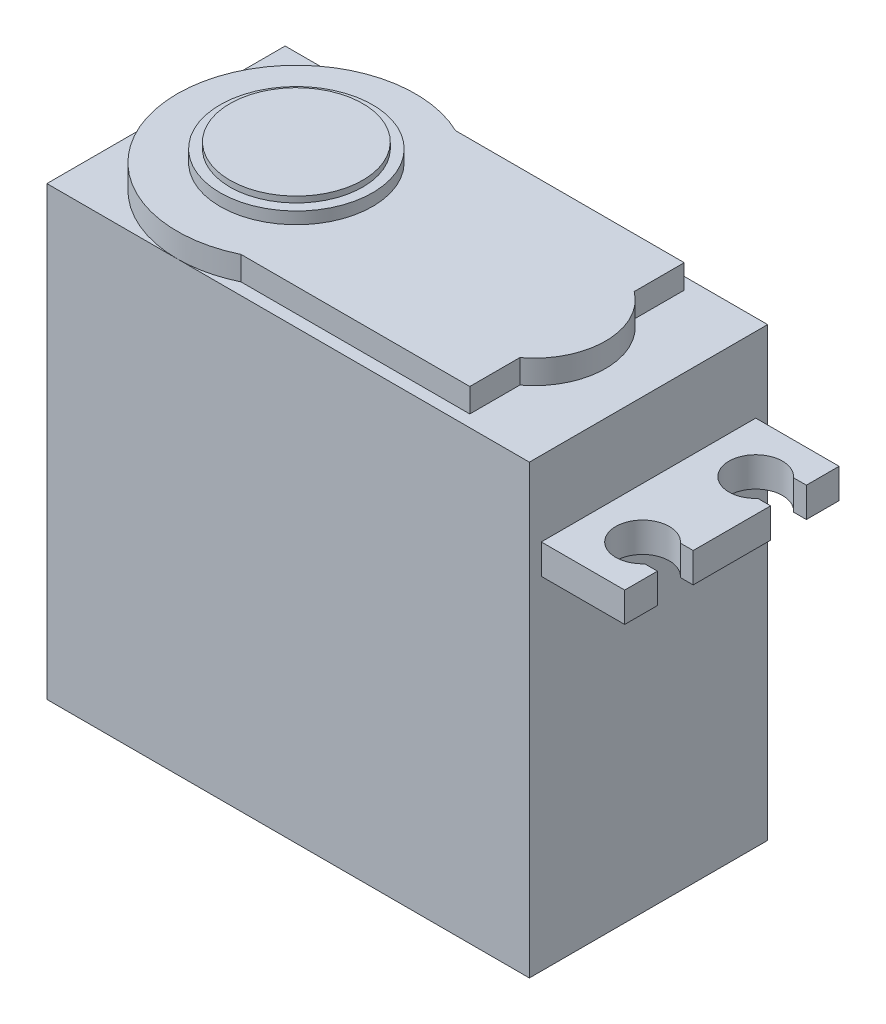
ISO-10303-21;
HEADER;
FILE_DESCRIPTION(('STEP AP214'),'2;1');
FILE_NAME('part.step','',(''),(''),'','','');
FILE_SCHEMA(('AUTOMOTIVE_DESIGN { 1 0 10303 214 1 1 1 1 }'));
ENDSEC;
DATA;
#1=APPLICATION_CONTEXT('core data for automotive mechanical design processes');
#2=APPLICATION_PROTOCOL_DEFINITION('international standard','automotive_design',2000,#1);
#3=PRODUCT_CONTEXT('',#1,'mechanical');
#4=PRODUCT('Part','Part','',(#3));
#5=PRODUCT_RELATED_PRODUCT_CATEGORY('part','',(#4));
#6=PRODUCT_DEFINITION_FORMATION('','',#4);
#7=PRODUCT_DEFINITION_CONTEXT('part definition',#1,'design');
#8=PRODUCT_DEFINITION('design','',#6,#7);
#9=PRODUCT_DEFINITION_SHAPE('','',#8);
#10=(LENGTH_UNIT() NAMED_UNIT(*) SI_UNIT(.MILLI.,.METRE.));
#11=(NAMED_UNIT(*) PLANE_ANGLE_UNIT() SI_UNIT($,.RADIAN.));
#12=(NAMED_UNIT(*) SI_UNIT($,.STERADIAN.) SOLID_ANGLE_UNIT());
#13=UNCERTAINTY_MEASURE_WITH_UNIT(LENGTH_MEASURE(1.E-05),#10,'distance_accuracy_value','');
#14=(GEOMETRIC_REPRESENTATION_CONTEXT(3) GLOBAL_UNCERTAINTY_ASSIGNED_CONTEXT((#13)) GLOBAL_UNIT_ASSIGNED_CONTEXT((#10,
#11,#12)) REPRESENTATION_CONTEXT('',''));
#15=CARTESIAN_POINT('',(0.,0.,0.));
#16=DIRECTION('',(0.,0.,1.));
#17=DIRECTION('',(1.,0.,0.));
#18=AXIS2_PLACEMENT_3D('',#15,#16,#17);
#19=CARTESIAN_POINT('',(-20.25,37.5,10.));
#20=DIRECTION('',(1.,0.,0.));
#21=DIRECTION('',(0.,0.,-1.));
#22=AXIS2_PLACEMENT_3D('',#19,#20,#21);
#23=PLANE('',#22);
#24=DIRECTION('',(0.,-1.,0.));
#25=VECTOR('',#24,1.);
#26=CARTESIAN_POINT('',(-20.25,37.5,-10.));
#27=LINE('',#26,#25);
#28=CARTESIAN_POINT('',(-20.25,37.5,-10.));
#29=VERTEX_POINT('',#28);
#30=CARTESIAN_POINT('',(-20.25,0.,-10.));
#31=VERTEX_POINT('',#30);
#32=EDGE_CURVE('E343',#29,#31,#27,.T.);
#33=ORIENTED_EDGE('',*,*,#32,.T.);
#34=DIRECTION('',(0.,0.,1.));
#35=VECTOR('',#34,1.);
#36=CARTESIAN_POINT('',(-20.25,0.,10.));
#37=LINE('',#36,#35);
#38=CARTESIAN_POINT('',(-20.25,0.,10.));
#39=VERTEX_POINT('',#38);
#40=EDGE_CURVE('E329',#31,#39,#37,.T.);
#41=ORIENTED_EDGE('',*,*,#40,.T.);
#42=DIRECTION('',(0.,-1.,0.));
#43=VECTOR('',#42,1.);
#44=CARTESIAN_POINT('',(-20.25,37.5,10.));
#45=LINE('',#44,#43);
#46=CARTESIAN_POINT('',(-20.25,37.5,10.));
#47=VERTEX_POINT('',#46);
#48=EDGE_CURVE('E37',#47,#39,#45,.T.);
#49=ORIENTED_EDGE('',*,*,#48,.F.);
#50=DIRECTION('',(0.,0.,1.));
#51=VECTOR('',#50,1.);
#52=CARTESIAN_POINT('',(-20.25,37.5,10.));
#53=LINE('',#52,#51);
#54=EDGE_CURVE('E330',#29,#47,#53,.T.);
#55=ORIENTED_EDGE('',*,*,#54,.F.);
#56=EDGE_LOOP('',(#33,#41,#49,#55));
#57=FACE_BOUND('',#56,.T.);
#58=ADVANCED_FACE('F34',(#57),#23,.F.);
#59=CARTESIAN_POINT('',(20.25,37.5,10.));
#60=DIRECTION('',(-1.,0.,0.));
#61=DIRECTION('',(0.,0.,1.));
#62=AXIS2_PLACEMENT_3D('',#59,#60,#61);
#63=PLANE('',#62);
#64=DIRECTION('',(0.,0.,-1.));
#65=VECTOR('',#64,1.);
#66=CARTESIAN_POINT('',(20.25,0.,10.));
#67=LINE('',#66,#65);
#68=CARTESIAN_POINT('',(20.25,0.,10.));
#69=VERTEX_POINT('',#68);
#70=CARTESIAN_POINT('',(20.25,0.,-10.));
#71=VERTEX_POINT('',#70);
#72=EDGE_CURVE('E348',#69,#71,#67,.T.);
#73=ORIENTED_EDGE('',*,*,#72,.T.);
#74=DIRECTION('',(0.,-1.,0.));
#75=VECTOR('',#74,1.);
#76=CARTESIAN_POINT('',(20.25,37.5,-10.));
#77=LINE('',#76,#75);
#78=CARTESIAN_POINT('',(20.25,37.5,-10.));
#79=VERTEX_POINT('',#78);
#80=EDGE_CURVE('E353',#79,#71,#77,.T.);
#81=ORIENTED_EDGE('',*,*,#80,.F.);
#82=DIRECTION('',(0.,0.,-1.));
#83=VECTOR('',#82,1.);
#84=CARTESIAN_POINT('',(20.25,37.5,10.));
#85=LINE('',#84,#83);
#86=CARTESIAN_POINT('',(20.25,37.5,10.));
#87=VERTEX_POINT('',#86);
#88=EDGE_CURVE('E338',#87,#79,#85,.T.);
#89=ORIENTED_EDGE('',*,*,#88,.F.);
#90=DIRECTION('',(0.,-1.,0.));
#91=VECTOR('',#90,1.);
#92=CARTESIAN_POINT('',(20.25,37.5,10.));
#93=LINE('',#92,#91);
#94=EDGE_CURVE('E355',#87,#69,#93,.T.);
#95=ORIENTED_EDGE('',*,*,#94,.T.);
#96=EDGE_LOOP('',(#73,#81,#89,#95));
#97=FACE_BOUND('',#96,.T.);
#98=DIRECTION('',(0.,0.,1.));
#99=VECTOR('',#98,1.);
#100=CARTESIAN_POINT('',(20.25,28.7,0.));
#101=LINE('',#100,#99);
#102=CARTESIAN_POINT('',(20.25,28.7,-9.));
#103=VERTEX_POINT('',#102);
#104=CARTESIAN_POINT('',(20.25,28.7,9.));
#105=VERTEX_POINT('',#104);
#106=EDGE_CURVE('E192',#103,#105,#101,.T.);
#107=ORIENTED_EDGE('',*,*,#106,.T.);
#108=DIRECTION('',(0.,1.,0.));
#109=VECTOR('',#108,1.);
#110=CARTESIAN_POINT('',(20.25,28.7,9.));
#111=LINE('',#110,#109);
#112=CARTESIAN_POINT('',(20.25,31.2,9.));
#113=VERTEX_POINT('',#112);
#114=EDGE_CURVE('E197',#105,#113,#111,.T.);
#115=ORIENTED_EDGE('',*,*,#114,.T.);
#116=DIRECTION('',(0.,0.,1.));
#117=VECTOR('',#116,1.);
#118=CARTESIAN_POINT('',(20.25,31.2,0.));
#119=LINE('',#118,#117);
#120=CARTESIAN_POINT('',(20.25,31.2,-9.));
#121=VERTEX_POINT('',#120);
#122=EDGE_CURVE('E244',#121,#113,#119,.T.);
#123=ORIENTED_EDGE('',*,*,#122,.F.);
#124=DIRECTION('',(0.,1.,0.));
#125=VECTOR('',#124,1.);
#126=CARTESIAN_POINT('',(20.25,28.7,-9.));
#127=LINE('',#126,#125);
#128=EDGE_CURVE('E198',#103,#121,#127,.T.);
#129=ORIENTED_EDGE('',*,*,#128,.F.);
#130=EDGE_LOOP('',(#107,#115,#123,#129));
#131=FACE_BOUND('',#130,.T.);
#132=ADVANCED_FACE('F194',(#97,#131),#63,.F.);
#133=CARTESIAN_POINT('',(-9.30889894354066,40.5,0.));
#134=DIRECTION('',(0.,1.,0.));
#135=DIRECTION('',(0.,0.,1.));
#136=AXIS2_PLACEMENT_3D('',#133,#134,#135);
#137=PLANE('',#136);
#138=CARTESIAN_POINT('',(-9.30889894354066,40.5,0.));
#139=DIRECTION('',(0.,1.,0.));
#140=DIRECTION('',(0.,0.,1.));
#141=AXIS2_PLACEMENT_3D('',#138,#139,#140);
#142=CIRCLE('',#141,6.4);
#143=CARTESIAN_POINT('',(-9.30889894354066,40.5,6.4));
#144=VERTEX_POINT('',#143);
#145=EDGE_CURVE('E279',#144,#144,#142,.T.);
#146=ORIENTED_EDGE('',*,*,#145,.T.);
#147=EDGE_LOOP('',(#146));
#148=FACE_BOUND('',#147,.T.);
#149=CARTESIAN_POINT('',(-9.30889894354066,40.5,0.));
#150=DIRECTION('',(0.,1.,0.));
#151=DIRECTION('',(0.,0.,1.));
#152=AXIS2_PLACEMENT_3D('',#149,#150,#151);
#153=CIRCLE('',#152,5.575);
#154=CARTESIAN_POINT('',(-9.30889894354066,40.5,5.575));
#155=VERTEX_POINT('',#154);
#156=EDGE_CURVE('E263',#155,#155,#153,.T.);
#157=ORIENTED_EDGE('',*,*,#156,.F.);
#158=EDGE_LOOP('',(#157));
#159=FACE_BOUND('',#158,.T.);
#160=ADVANCED_FACE('F406',(#148,#159),#137,.T.);
#161=CARTESIAN_POINT('',(-9.30889894354066,39.5,0.));
#162=DIRECTION('',(0.,1.,0.));
#163=DIRECTION('',(0.,0.,1.));
#164=AXIS2_PLACEMENT_3D('',#161,#162,#163);
#165=PLANE('',#164);
#166=CARTESIAN_POINT('',(-9.30889894354066,39.5,0.));
#167=DIRECTION('',(0.,1.,0.));
#168=DIRECTION('',(0.,0.,1.));
#169=AXIS2_PLACEMENT_3D('',#166,#167,#168);
#170=CIRCLE('',#169,10.);
#171=CARTESIAN_POINT('',(-4.94999999999999,39.5,-9.));
#172=VERTEX_POINT('',#171);
#173=CARTESIAN_POINT('',(-4.94999999999999,39.5,9.00000000000001));
#174=VERTEX_POINT('',#173);
#175=EDGE_CURVE('E284',#172,#174,#170,.T.);
#176=ORIENTED_EDGE('',*,*,#175,.T.);
#177=DIRECTION('',(1.,0.,0.));
#178=VECTOR('',#177,1.);
#179=CARTESIAN_POINT('',(-4.94999999999999,39.5,9.00000000000001));
#180=LINE('',#179,#178);
#181=CARTESIAN_POINT('',(14.25,39.5,9.00000000000001));
#182=VERTEX_POINT('',#181);
#183=EDGE_CURVE('E287',#174,#182,#180,.T.);
#184=ORIENTED_EDGE('',*,*,#183,.T.);
#185=DIRECTION('',(0.,0.,-1.));
#186=VECTOR('',#185,1.);
#187=CARTESIAN_POINT('',(14.25,39.5,9.00000000000001));
#188=LINE('',#187,#186);
#189=CARTESIAN_POINT('',(14.25,39.5,4.8));
#190=VERTEX_POINT('',#189);
#191=EDGE_CURVE('E290',#182,#190,#188,.T.);
#192=ORIENTED_EDGE('',*,*,#191,.T.);
#193=CARTESIAN_POINT('',(10.65,39.5,0.));
#194=DIRECTION('',(0.,1.,0.));
#195=DIRECTION('',(0.,0.,-1.));
#196=AXIS2_PLACEMENT_3D('',#193,#194,#195);
#197=CIRCLE('',#196,6.00000000000001);
#198=CARTESIAN_POINT('',(14.25,39.5,-4.8));
#199=VERTEX_POINT('',#198);
#200=EDGE_CURVE('E292',#190,#199,#197,.T.);
#201=ORIENTED_EDGE('',*,*,#200,.T.);
#202=DIRECTION('',(0.,0.,-1.));
#203=VECTOR('',#202,1.);
#204=CARTESIAN_POINT('',(14.25,39.5,-9.));
#205=LINE('',#204,#203);
#206=CARTESIAN_POINT('',(14.25,39.5,-9.));
#207=VERTEX_POINT('',#206);
#208=EDGE_CURVE('E294',#199,#207,#205,.T.);
#209=ORIENTED_EDGE('',*,*,#208,.T.);
#210=DIRECTION('',(-1.,0.,0.));
#211=VECTOR('',#210,1.);
#212=CARTESIAN_POINT('',(-4.94999999999999,39.5,-9.));
#213=LINE('',#212,#211);
#214=EDGE_CURVE('E296',#207,#172,#213,.T.);
#215=ORIENTED_EDGE('',*,*,#214,.T.);
#216=EDGE_LOOP('',(#176,#184,#192,#201,#209,#215));
#217=FACE_BOUND('',#216,.T.);
#218=CARTESIAN_POINT('',(-9.30889894354066,39.5,0.));
#219=DIRECTION('',(0.,1.,0.));
#220=DIRECTION('',(0.,0.,1.));
#221=AXIS2_PLACEMENT_3D('',#218,#219,#220);
#222=CIRCLE('',#221,6.4);
#223=CARTESIAN_POINT('',(-9.30889894354066,39.5,6.4));
#224=VERTEX_POINT('',#223);
#225=EDGE_CURVE('E276',#224,#224,#222,.T.);
#226=ORIENTED_EDGE('',*,*,#225,.F.);
#227=EDGE_LOOP('',(#226));
#228=FACE_BOUND('',#227,.T.);
#229=ADVANCED_FACE('F375',(#217,#228),#165,.T.);
#230=CARTESIAN_POINT('',(0.,37.5,0.));
#231=DIRECTION('',(0.,-1.,0.));
#232=DIRECTION('',(0.,0.,-1.));
#233=AXIS2_PLACEMENT_3D('',#230,#231,#232);
#234=PLANE('',#233);
#235=CARTESIAN_POINT('',(-9.30889894354066,37.5,0.));
#236=DIRECTION('',(0.,1.,0.));
#237=DIRECTION('',(0.,0.,1.));
#238=AXIS2_PLACEMENT_3D('',#235,#236,#237);
#239=CIRCLE('',#238,10.);
#240=CARTESIAN_POINT('',(-4.94999999999999,37.5,-9.));
#241=VERTEX_POINT('',#240);
#242=CARTESIAN_POINT('',(-9.30889894354066,37.5,-10.));
#243=VERTEX_POINT('',#242);
#244=EDGE_CURVE('E44',#241,#243,#239,.T.);
#245=ORIENTED_EDGE('',*,*,#244,.F.);
#246=DIRECTION('',(-1.,0.,0.));
#247=VECTOR('',#246,1.);
#248=CARTESIAN_POINT('',(-4.94999999999999,37.5,-9.));
#249=LINE('',#248,#247);
#250=CARTESIAN_POINT('',(14.25,37.5,-9.));
#251=VERTEX_POINT('',#250);
#252=EDGE_CURVE('E288',#251,#241,#249,.T.);
#253=ORIENTED_EDGE('',*,*,#252,.F.);
#254=DIRECTION('',(0.,0.,-1.));
#255=VECTOR('',#254,1.);
#256=CARTESIAN_POINT('',(14.25,37.5,-9.));
#257=LINE('',#256,#255);
#258=CARTESIAN_POINT('',(14.25,37.5,-4.8));
#259=VERTEX_POINT('',#258);
#260=EDGE_CURVE('E308',#259,#251,#257,.T.);
#261=ORIENTED_EDGE('',*,*,#260,.F.);
#262=CARTESIAN_POINT('',(10.65,37.5,0.));
#263=DIRECTION('',(0.,1.,0.));
#264=DIRECTION('',(0.,0.,-1.));
#265=AXIS2_PLACEMENT_3D('',#262,#263,#264);
#266=CIRCLE('',#265,6.00000000000001);
#267=CARTESIAN_POINT('',(14.25,37.5,4.8));
#268=VERTEX_POINT('',#267);
#269=EDGE_CURVE('E305',#268,#259,#266,.T.);
#270=ORIENTED_EDGE('',*,*,#269,.F.);
#271=DIRECTION('',(0.,0.,-1.));
#272=VECTOR('',#271,1.);
#273=CARTESIAN_POINT('',(14.25,37.5,9.00000000000001));
#274=LINE('',#273,#272);
#275=CARTESIAN_POINT('',(14.25,37.5,9.00000000000001));
#276=VERTEX_POINT('',#275);
#277=EDGE_CURVE('E302',#276,#268,#274,.T.);
#278=ORIENTED_EDGE('',*,*,#277,.F.);
#279=DIRECTION('',(1.,0.,0.));
#280=VECTOR('',#279,1.);
#281=CARTESIAN_POINT('',(-4.94999999999999,37.5,9.00000000000001));
#282=LINE('',#281,#280);
#283=CARTESIAN_POINT('',(-4.94999999999999,37.5,9.00000000000001));
#284=VERTEX_POINT('',#283);
#285=EDGE_CURVE('E299',#284,#276,#282,.T.);
#286=ORIENTED_EDGE('',*,*,#285,.F.);
#287=CARTESIAN_POINT('',(-9.30889894354066,37.5,10.));
#288=VERTEX_POINT('',#287);
#289=EDGE_CURVE('E42',#288,#284,#239,.T.);
#290=ORIENTED_EDGE('',*,*,#289,.F.);
#291=DIRECTION('',(1.,0.,0.));
#292=VECTOR('',#291,1.);
#293=CARTESIAN_POINT('',(-20.25,37.5,10.));
#294=LINE('',#293,#292);
#295=EDGE_CURVE('E333',#288,#87,#294,.T.);
#296=ORIENTED_EDGE('',*,*,#295,.T.);
#297=ORIENTED_EDGE('',*,*,#88,.T.);
#298=DIRECTION('',(-1.,0.,0.));
#299=VECTOR('',#298,1.);
#300=CARTESIAN_POINT('',(-20.25,37.5,-10.));
#301=LINE('',#300,#299);
#302=EDGE_CURVE('E341',#79,#243,#301,.T.);
#303=ORIENTED_EDGE('',*,*,#302,.T.);
#304=EDGE_LOOP('',(#245,#253,#261,#270,#278,#286,#290,#296,#297,#303));
#305=FACE_BOUND('',#304,.T.);
#306=ADVANCED_FACE('F382',(#305),#234,.F.);
#307=EDGE_CURVE('E11',#243,#288,#239,.T.);
#308=ORIENTED_EDGE('',*,*,#307,.F.);
#309=EDGE_CURVE('E340',#243,#29,#301,.T.);
#310=ORIENTED_EDGE('',*,*,#309,.T.);
#311=ORIENTED_EDGE('',*,*,#54,.T.);
#312=EDGE_CURVE('E335',#47,#288,#294,.T.);
#313=ORIENTED_EDGE('',*,*,#312,.T.);
#314=EDGE_LOOP('',(#308,#310,#311,#313));
#315=FACE_BOUND('',#314,.T.);
#316=ADVANCED_FACE('F421',(#315),#234,.F.);
#317=CARTESIAN_POINT('',(-20.25,37.5,10.));
#318=DIRECTION('',(0.,0.,-1.));
#319=DIRECTION('',(-1.,0.,0.));
#320=AXIS2_PLACEMENT_3D('',#317,#318,#319);
#321=PLANE('',#320);
#322=DIRECTION('',(1.,0.,0.));
#323=VECTOR('',#322,1.);
#324=CARTESIAN_POINT('',(-20.25,0.,10.));
#325=LINE('',#324,#323);
#326=EDGE_CURVE('E346',#39,#69,#325,.T.);
#327=ORIENTED_EDGE('',*,*,#326,.T.);
#328=ORIENTED_EDGE('',*,*,#94,.F.);
#329=ORIENTED_EDGE('',*,*,#295,.F.);
#330=ORIENTED_EDGE('',*,*,#312,.F.);
#331=ORIENTED_EDGE('',*,*,#48,.T.);
#332=EDGE_LOOP('',(#327,#328,#329,#330,#331));
#333=FACE_BOUND('',#332,.T.);
#334=ADVANCED_FACE('F419',(#333),#321,.F.);
#335=CARTESIAN_POINT('',(-20.25,37.5,-10.));
#336=DIRECTION('',(0.,0.,1.));
#337=DIRECTION('',(1.,0.,0.));
#338=AXIS2_PLACEMENT_3D('',#335,#336,#337);
#339=PLANE('',#338);
#340=DIRECTION('',(-1.,0.,0.));
#341=VECTOR('',#340,1.);
#342=CARTESIAN_POINT('',(-20.25,0.,-10.));
#343=LINE('',#342,#341);
#344=EDGE_CURVE('E334',#71,#31,#343,.T.);
#345=ORIENTED_EDGE('',*,*,#344,.T.);
#346=ORIENTED_EDGE('',*,*,#32,.F.);
#347=ORIENTED_EDGE('',*,*,#309,.F.);
#348=ORIENTED_EDGE('',*,*,#302,.F.);
#349=ORIENTED_EDGE('',*,*,#80,.T.);
#350=EDGE_LOOP('',(#345,#346,#347,#348,#349));
#351=FACE_BOUND('',#350,.T.);
#352=ADVANCED_FACE('F414',(#351),#339,.F.);
#353=CARTESIAN_POINT('',(0.,0.,0.));
#354=DIRECTION('',(0.,-1.,0.));
#355=DIRECTION('',(0.,0.,-1.));
#356=AXIS2_PLACEMENT_3D('',#353,#354,#355);
#357=PLANE('',#356);
#358=ORIENTED_EDGE('',*,*,#40,.F.);
#359=ORIENTED_EDGE('',*,*,#344,.F.);
#360=ORIENTED_EDGE('',*,*,#72,.F.);
#361=ORIENTED_EDGE('',*,*,#326,.F.);
#362=EDGE_LOOP('',(#358,#359,#360,#361));
#363=FACE_BOUND('',#362,.T.);
#364=ADVANCED_FACE('F418',(#363),#357,.T.);
#365=CARTESIAN_POINT('',(-9.30889894354066,39.5,0.));
#366=DIRECTION('',(0.,-1.,0.));
#367=DIRECTION('',(0.,0.,-1.));
#368=AXIS2_PLACEMENT_3D('',#365,#366,#367);
#369=CYLINDRICAL_SURFACE('',#368,10.);
#370=ORIENTED_EDGE('',*,*,#244,.T.);
#371=ORIENTED_EDGE('',*,*,#307,.T.);
#372=ORIENTED_EDGE('',*,*,#289,.T.);
#373=DIRECTION('',(0.,-1.,0.));
#374=VECTOR('',#373,1.);
#375=CARTESIAN_POINT('',(-4.94999999999999,39.5,9.00000000000001));
#376=LINE('',#375,#374);
#377=EDGE_CURVE('E326',#174,#284,#376,.T.);
#378=ORIENTED_EDGE('',*,*,#377,.F.);
#379=ORIENTED_EDGE('',*,*,#175,.F.);
#380=DIRECTION('',(0.,-1.,0.));
#381=VECTOR('',#380,1.);
#382=CARTESIAN_POINT('',(-4.94999999999999,39.5,-9.));
#383=LINE('',#382,#381);
#384=EDGE_CURVE('E297',#172,#241,#383,.T.);
#385=ORIENTED_EDGE('',*,*,#384,.T.);
#386=EDGE_LOOP('',(#370,#371,#372,#378,#379,#385));
#387=FACE_BOUND('',#386,.T.);
#388=ADVANCED_FACE('F367',(#387),#369,.T.);
#389=CARTESIAN_POINT('',(-4.94999999999999,39.5,9.00000000000001));
#390=DIRECTION('',(0.,0.,-1.));
#391=DIRECTION('',(-1.,0.,0.));
#392=AXIS2_PLACEMENT_3D('',#389,#390,#391);
#393=PLANE('',#392);
#394=ORIENTED_EDGE('',*,*,#285,.T.);
#395=DIRECTION('',(0.,-1.,0.));
#396=VECTOR('',#395,1.);
#397=CARTESIAN_POINT('',(14.25,39.5,9.00000000000001));
#398=LINE('',#397,#396);
#399=EDGE_CURVE('E323',#182,#276,#398,.T.);
#400=ORIENTED_EDGE('',*,*,#399,.F.);
#401=ORIENTED_EDGE('',*,*,#183,.F.);
#402=ORIENTED_EDGE('',*,*,#377,.T.);
#403=EDGE_LOOP('',(#394,#400,#401,#402));
#404=FACE_BOUND('',#403,.T.);
#405=ADVANCED_FACE('F371',(#404),#393,.F.);
#406=CARTESIAN_POINT('',(14.25,39.5,9.00000000000001));
#407=DIRECTION('',(-1.,0.,0.));
#408=DIRECTION('',(0.,0.,1.));
#409=AXIS2_PLACEMENT_3D('',#406,#407,#408);
#410=PLANE('',#409);
#411=ORIENTED_EDGE('',*,*,#277,.T.);
#412=DIRECTION('',(0.,-1.,0.));
#413=VECTOR('',#412,1.);
#414=CARTESIAN_POINT('',(14.25,39.5,4.8));
#415=LINE('',#414,#413);
#416=EDGE_CURVE('E320',#190,#268,#415,.T.);
#417=ORIENTED_EDGE('',*,*,#416,.F.);
#418=ORIENTED_EDGE('',*,*,#191,.F.);
#419=ORIENTED_EDGE('',*,*,#399,.T.);
#420=EDGE_LOOP('',(#411,#417,#418,#419));
#421=FACE_BOUND('',#420,.T.);
#422=ADVANCED_FACE('F392',(#421),#410,.F.);
#423=CARTESIAN_POINT('',(10.65,39.5,0.));
#424=DIRECTION('',(0.,-1.,0.));
#425=DIRECTION('',(0.,0.,-1.));
#426=AXIS2_PLACEMENT_3D('',#423,#424,#425);
#427=CYLINDRICAL_SURFACE('',#426,6.00000000000001);
#428=ORIENTED_EDGE('',*,*,#269,.T.);
#429=DIRECTION('',(0.,-1.,0.));
#430=VECTOR('',#429,1.);
#431=CARTESIAN_POINT('',(14.25,39.5,-4.8));
#432=LINE('',#431,#430);
#433=EDGE_CURVE('E317',#199,#259,#432,.T.);
#434=ORIENTED_EDGE('',*,*,#433,.F.);
#435=ORIENTED_EDGE('',*,*,#200,.F.);
#436=ORIENTED_EDGE('',*,*,#416,.T.);
#437=EDGE_LOOP('',(#428,#434,#435,#436));
#438=FACE_BOUND('',#437,.T.);
#439=ADVANCED_FACE('F389',(#438),#427,.T.);
#440=CARTESIAN_POINT('',(14.25,39.5,-9.));
#441=DIRECTION('',(-1.,0.,0.));
#442=DIRECTION('',(0.,0.,1.));
#443=AXIS2_PLACEMENT_3D('',#440,#441,#442);
#444=PLANE('',#443);
#445=ORIENTED_EDGE('',*,*,#260,.T.);
#446=DIRECTION('',(0.,-1.,0.));
#447=VECTOR('',#446,1.);
#448=CARTESIAN_POINT('',(14.25,39.5,-9.));
#449=LINE('',#448,#447);
#450=EDGE_CURVE('E314',#207,#251,#449,.T.);
#451=ORIENTED_EDGE('',*,*,#450,.F.);
#452=ORIENTED_EDGE('',*,*,#208,.F.);
#453=ORIENTED_EDGE('',*,*,#433,.T.);
#454=EDGE_LOOP('',(#445,#451,#452,#453));
#455=FACE_BOUND('',#454,.T.);
#456=ADVANCED_FACE('F384',(#455),#444,.F.);
#457=CARTESIAN_POINT('',(-4.94999999999999,39.5,-9.));
#458=DIRECTION('',(0.,0.,1.));
#459=DIRECTION('',(1.,0.,0.));
#460=AXIS2_PLACEMENT_3D('',#457,#458,#459);
#461=PLANE('',#460);
#462=ORIENTED_EDGE('',*,*,#252,.T.);
#463=ORIENTED_EDGE('',*,*,#384,.F.);
#464=ORIENTED_EDGE('',*,*,#214,.F.);
#465=ORIENTED_EDGE('',*,*,#450,.T.);
#466=EDGE_LOOP('',(#462,#463,#464,#465));
#467=FACE_BOUND('',#466,.T.);
#468=ADVANCED_FACE('F380',(#467),#461,.F.);
#469=CARTESIAN_POINT('',(-9.30889894354066,40.5,0.));
#470=DIRECTION('',(0.,-1.,0.));
#471=DIRECTION('',(0.,0.,-1.));
#472=AXIS2_PLACEMENT_3D('',#469,#470,#471);
#473=CYLINDRICAL_SURFACE('',#472,6.4);
#474=ORIENTED_EDGE('',*,*,#145,.F.);
#475=EDGE_LOOP('',(#474));
#476=FACE_BOUND('',#475,.T.);
#477=ORIENTED_EDGE('',*,*,#225,.T.);
#478=EDGE_LOOP('',(#477));
#479=FACE_BOUND('',#478,.T.);
#480=ADVANCED_FACE('F478',(#476,#479),#473,.T.);
#481=CARTESIAN_POINT('',(-9.30889894354066,41.,0.));
#482=DIRECTION('',(0.,-1.,0.));
#483=DIRECTION('',(0.,0.,-1.));
#484=AXIS2_PLACEMENT_3D('',#481,#482,#483);
#485=CYLINDRICAL_SURFACE('',#484,5.575);
#486=CARTESIAN_POINT('',(-9.30889894354066,41.,0.));
#487=DIRECTION('',(0.,1.,0.));
#488=DIRECTION('',(0.,0.,1.));
#489=AXIS2_PLACEMENT_3D('',#486,#487,#488);
#490=CIRCLE('',#489,5.575);
#491=CARTESIAN_POINT('',(-9.30889894354066,41.,5.575));
#492=VERTEX_POINT('',#491);
#493=EDGE_CURVE('E273',#492,#492,#490,.T.);
#494=ORIENTED_EDGE('',*,*,#493,.F.);
#495=EDGE_LOOP('',(#494));
#496=FACE_BOUND('',#495,.T.);
#497=ORIENTED_EDGE('',*,*,#156,.T.);
#498=EDGE_LOOP('',(#497));
#499=FACE_BOUND('',#498,.T.);
#500=ADVANCED_FACE('F496',(#496,#499),#485,.T.);
#501=CARTESIAN_POINT('',(-9.30889894354066,41.,0.));
#502=DIRECTION('',(0.,1.,0.));
#503=DIRECTION('',(0.,0.,1.));
#504=AXIS2_PLACEMENT_3D('',#501,#502,#503);
#505=PLANE('',#504);
#506=ORIENTED_EDGE('',*,*,#493,.T.);
#507=EDGE_LOOP('',(#506));
#508=FACE_BOUND('',#507,.T.);
#509=ADVANCED_FACE('F515',(#508),#505,.T.);
#510=CARTESIAN_POINT('',(20.25,28.7,-9.));
#511=DIRECTION('',(0.,0.,-1.));
#512=DIRECTION('',(-1.,0.,0.));
#513=AXIS2_PLACEMENT_3D('',#510,#511,#512);
#514=PLANE('',#513);
#515=DIRECTION('',(-1.,0.,0.));
#516=VECTOR('',#515,1.);
#517=CARTESIAN_POINT('',(20.25,31.2,-9.));
#518=LINE('',#517,#516);
#519=CARTESIAN_POINT('',(27.25,31.2,-9.));
#520=VERTEX_POINT('',#519);
#521=EDGE_CURVE('E51',#520,#121,#518,.T.);
#522=ORIENTED_EDGE('',*,*,#521,.F.);
#523=DIRECTION('',(0.,1.,0.));
#524=VECTOR('',#523,1.);
#525=CARTESIAN_POINT('',(27.25,28.7,-9.));
#526=LINE('',#525,#524);
#527=CARTESIAN_POINT('',(27.25,28.7,-9.));
#528=VERTEX_POINT('',#527);
#529=EDGE_CURVE('E264',#528,#520,#526,.T.);
#530=ORIENTED_EDGE('',*,*,#529,.F.);
#531=DIRECTION('',(-1.,0.,0.));
#532=VECTOR('',#531,1.);
#533=CARTESIAN_POINT('',(20.25,28.7,-9.));
#534=LINE('',#533,#532);
#535=EDGE_CURVE('E241',#528,#103,#534,.T.);
#536=ORIENTED_EDGE('',*,*,#535,.T.);
#537=ORIENTED_EDGE('',*,*,#128,.T.);
#538=EDGE_LOOP('',(#522,#530,#536,#537));
#539=FACE_BOUND('',#538,.T.);
#540=ADVANCED_FACE('F525',(#539),#514,.T.);
#541=CARTESIAN_POINT('',(27.25,28.7,-6.25));
#542=DIRECTION('',(1.,0.,0.));
#543=DIRECTION('',(0.,0.,-1.));
#544=AXIS2_PLACEMENT_3D('',#541,#542,#543);
#545=PLANE('',#544);
#546=DIRECTION('',(0.,0.,-1.));
#547=VECTOR('',#546,1.);
#548=CARTESIAN_POINT('',(27.25,31.2,-6.25));
#549=LINE('',#548,#547);
#550=CARTESIAN_POINT('',(27.25,31.2,-6.25));
#551=VERTEX_POINT('',#550);
#552=EDGE_CURVE('E259',#551,#520,#549,.T.);
#553=ORIENTED_EDGE('',*,*,#552,.F.);
#554=DIRECTION('',(0.,1.,0.));
#555=VECTOR('',#554,1.);
#556=CARTESIAN_POINT('',(27.25,28.7,-6.25));
#557=LINE('',#556,#555);
#558=CARTESIAN_POINT('',(27.25,28.7,-6.25));
#559=VERTEX_POINT('',#558);
#560=EDGE_CURVE('E266',#559,#551,#557,.T.);
#561=ORIENTED_EDGE('',*,*,#560,.F.);
#562=DIRECTION('',(0.,0.,-1.));
#563=VECTOR('',#562,1.);
#564=CARTESIAN_POINT('',(27.25,28.7,-6.25));
#565=LINE('',#564,#563);
#566=EDGE_CURVE('E238',#559,#528,#565,.T.);
#567=ORIENTED_EDGE('',*,*,#566,.T.);
#568=ORIENTED_EDGE('',*,*,#529,.T.);
#569=EDGE_LOOP('',(#553,#561,#567,#568));
#570=FACE_BOUND('',#569,.T.);
#571=ADVANCED_FACE('F535',(#570),#545,.T.);
#572=CARTESIAN_POINT('',(26.1770509831249,28.7,-6.25));
#573=DIRECTION('',(0.,0.,1.));
#574=DIRECTION('',(1.,0.,0.));
#575=AXIS2_PLACEMENT_3D('',#572,#573,#574);
#576=PLANE('',#575);
#577=DIRECTION('',(1.,0.,0.));
#578=VECTOR('',#577,1.);
#579=CARTESIAN_POINT('',(26.1770509831249,31.2,-6.25));
#580=LINE('',#579,#578);
#581=CARTESIAN_POINT('',(26.1770509831249,31.2,-6.25));
#582=VERTEX_POINT('',#581);
#583=EDGE_CURVE('E256',#582,#551,#580,.T.);
#584=ORIENTED_EDGE('',*,*,#583,.F.);
#585=DIRECTION('',(0.,1.,0.));
#586=VECTOR('',#585,1.);
#587=CARTESIAN_POINT('',(26.1770509831249,28.7,-6.25));
#588=LINE('',#587,#586);
#589=CARTESIAN_POINT('',(26.1770509831249,28.7,-6.25));
#590=VERTEX_POINT('',#589);
#591=EDGE_CURVE('E268',#590,#582,#588,.T.);
#592=ORIENTED_EDGE('',*,*,#591,.F.);
#593=DIRECTION('',(1.,0.,0.));
#594=VECTOR('',#593,1.);
#595=CARTESIAN_POINT('',(26.1770509831249,28.7,-6.25));
#596=LINE('',#595,#594);
#597=EDGE_CURVE('E235',#590,#559,#596,.T.);
#598=ORIENTED_EDGE('',*,*,#597,.T.);
#599=ORIENTED_EDGE('',*,*,#560,.T.);
#600=EDGE_LOOP('',(#584,#592,#598,#599));
#601=FACE_BOUND('',#600,.T.);
#602=ADVANCED_FACE('F545',(#601),#576,.T.);
#603=CARTESIAN_POINT('',(24.5,28.7,-4.75));
#604=DIRECTION('',(0.,1.,0.));
#605=DIRECTION('',(0.,0.,1.));
#606=AXIS2_PLACEMENT_3D('',#603,#604,#605);
#607=CYLINDRICAL_SURFACE('',#606,2.25);
#608=CARTESIAN_POINT('',(24.5,31.2,-4.75));
#609=DIRECTION('',(0.,-1.,0.));
#610=DIRECTION('',(0.,0.,1.));
#611=AXIS2_PLACEMENT_3D('',#608,#609,#610);
#612=CIRCLE('',#611,2.25);
#613=CARTESIAN_POINT('',(26.1770509831249,31.2,-3.25));
#614=VERTEX_POINT('',#613);
#615=EDGE_CURVE('E253',#614,#582,#612,.T.);
#616=ORIENTED_EDGE('',*,*,#615,.F.);
#617=DIRECTION('',(0.,1.,0.));
#618=VECTOR('',#617,1.);
#619=CARTESIAN_POINT('',(26.1770509831249,28.7,-3.25));
#620=LINE('',#619,#618);
#621=CARTESIAN_POINT('',(26.1770509831249,28.7,-3.25));
#622=VERTEX_POINT('',#621);
#623=EDGE_CURVE('E270',#622,#614,#620,.T.);
#624=ORIENTED_EDGE('',*,*,#623,.F.);
#625=CARTESIAN_POINT('',(24.5,28.7,-4.75));
#626=DIRECTION('',(0.,-1.,0.));
#627=DIRECTION('',(0.,0.,1.));
#628=AXIS2_PLACEMENT_3D('',#625,#626,#627);
#629=CIRCLE('',#628,2.25);
#630=EDGE_CURVE('E232',#622,#590,#629,.T.);
#631=ORIENTED_EDGE('',*,*,#630,.T.);
#632=ORIENTED_EDGE('',*,*,#591,.T.);
#633=EDGE_LOOP('',(#616,#624,#631,#632));
#634=FACE_BOUND('',#633,.T.);
#635=ADVANCED_FACE('F555',(#634),#607,.F.);
#636=CARTESIAN_POINT('',(26.1770509831249,28.7,-3.25));
#637=DIRECTION('',(0.,0.,-1.));
#638=DIRECTION('',(-1.,0.,0.));
#639=AXIS2_PLACEMENT_3D('',#636,#637,#638);
#640=PLANE('',#639);
#641=DIRECTION('',(-1.,0.,0.));
#642=VECTOR('',#641,1.);
#643=CARTESIAN_POINT('',(26.1770509831249,31.2,-3.25));
#644=LINE('',#643,#642);
#645=CARTESIAN_POINT('',(27.25,31.2,-3.25));
#646=VERTEX_POINT('',#645);
#647=EDGE_CURVE('E250',#646,#614,#644,.T.);
#648=ORIENTED_EDGE('',*,*,#647,.F.);
#649=DIRECTION('',(0.,1.,0.));
#650=VECTOR('',#649,1.);
#651=CARTESIAN_POINT('',(27.25,28.7,-3.25));
#652=LINE('',#651,#650);
#653=CARTESIAN_POINT('',(27.25,28.7,-3.25));
#654=VERTEX_POINT('',#653);
#655=EDGE_CURVE('E243',#654,#646,#652,.T.);
#656=ORIENTED_EDGE('',*,*,#655,.F.);
#657=DIRECTION('',(-1.,0.,0.));
#658=VECTOR('',#657,1.);
#659=CARTESIAN_POINT('',(26.1770509831249,28.7,-3.25));
#660=LINE('',#659,#658);
#661=EDGE_CURVE('E229',#654,#622,#660,.T.);
#662=ORIENTED_EDGE('',*,*,#661,.T.);
#663=ORIENTED_EDGE('',*,*,#623,.T.);
#664=EDGE_LOOP('',(#648,#656,#662,#663));
#665=FACE_BOUND('',#664,.T.);
#666=ADVANCED_FACE('F565',(#665),#640,.T.);
#667=CARTESIAN_POINT('',(27.25,28.7,0.));
#668=DIRECTION('',(1.,0.,0.));
#669=DIRECTION('',(0.,0.,-1.));
#670=AXIS2_PLACEMENT_3D('',#667,#668,#669);
#671=PLANE('',#670);
#672=DIRECTION('',(0.,0.,-1.));
#673=VECTOR('',#672,1.);
#674=CARTESIAN_POINT('',(27.25,31.2,0.));
#675=LINE('',#674,#673);
#676=CARTESIAN_POINT('',(27.25,31.2,3.25));
#677=VERTEX_POINT('',#676);
#678=EDGE_CURVE('E246',#677,#646,#675,.T.);
#679=ORIENTED_EDGE('',*,*,#678,.F.);
#680=DIRECTION('',(0.,1.,0.));
#681=VECTOR('',#680,1.);
#682=CARTESIAN_POINT('',(27.25,28.7,3.25));
#683=LINE('',#682,#681);
#684=CARTESIAN_POINT('',(27.25,28.7,3.25));
#685=VERTEX_POINT('',#684);
#686=EDGE_CURVE('E247',#685,#677,#683,.T.);
#687=ORIENTED_EDGE('',*,*,#686,.F.);
#688=DIRECTION('',(0.,0.,-1.));
#689=VECTOR('',#688,1.);
#690=CARTESIAN_POINT('',(27.25,28.7,0.));
#691=LINE('',#690,#689);
#692=EDGE_CURVE('E202',#685,#654,#691,.T.);
#693=ORIENTED_EDGE('',*,*,#692,.T.);
#694=ORIENTED_EDGE('',*,*,#655,.T.);
#695=EDGE_LOOP('',(#679,#687,#693,#694));
#696=FACE_BOUND('',#695,.T.);
#697=ADVANCED_FACE('F575',(#696),#671,.T.);
#698=CARTESIAN_POINT('',(24.5,28.7,-4.75));
#699=DIRECTION('',(0.,1.,0.));
#700=DIRECTION('',(0.,0.,1.));
#701=AXIS2_PLACEMENT_3D('',#698,#699,#700);
#702=PLANE('',#701);
#703=ORIENTED_EDGE('',*,*,#106,.F.);
#704=ORIENTED_EDGE('',*,*,#535,.F.);
#705=ORIENTED_EDGE('',*,*,#566,.F.);
#706=ORIENTED_EDGE('',*,*,#597,.F.);
#707=ORIENTED_EDGE('',*,*,#630,.F.);
#708=ORIENTED_EDGE('',*,*,#661,.F.);
#709=ORIENTED_EDGE('',*,*,#692,.F.);
#710=DIRECTION('',(-1.,0.,0.));
#711=VECTOR('',#710,1.);
#712=CARTESIAN_POINT('',(26.1770509831249,28.7,3.25));
#713=LINE('',#712,#711);
#714=CARTESIAN_POINT('',(26.1770509831249,28.7,3.25));
#715=VERTEX_POINT('',#714);
#716=EDGE_CURVE('E219',#685,#715,#713,.T.);
#717=ORIENTED_EDGE('',*,*,#716,.T.);
#718=CARTESIAN_POINT('',(24.5,28.7,4.75));
#719=DIRECTION('',(0.,1.,0.));
#720=DIRECTION('',(0.,0.,-1.));
#721=AXIS2_PLACEMENT_3D('',#718,#719,#720);
#722=CIRCLE('',#721,2.25);
#723=CARTESIAN_POINT('',(26.1770509831249,28.7,6.25));
#724=VERTEX_POINT('',#723);
#725=EDGE_CURVE('E223',#715,#724,#722,.T.);
#726=ORIENTED_EDGE('',*,*,#725,.T.);
#727=DIRECTION('',(1.,0.,0.));
#728=VECTOR('',#727,1.);
#729=CARTESIAN_POINT('',(26.1770509831249,28.7,6.25));
#730=LINE('',#729,#728);
#731=CARTESIAN_POINT('',(27.25,28.7,6.25));
#732=VERTEX_POINT('',#731);
#733=EDGE_CURVE('E693',#724,#732,#730,.T.);
#734=ORIENTED_EDGE('',*,*,#733,.T.);
#735=DIRECTION('',(0.,0.,1.));
#736=VECTOR('',#735,1.);
#737=CARTESIAN_POINT('',(27.25,28.7,6.25));
#738=LINE('',#737,#736);
#739=CARTESIAN_POINT('',(27.25,28.7,9.));
#740=VERTEX_POINT('',#739);
#741=EDGE_CURVE('E208',#732,#740,#738,.T.);
#742=ORIENTED_EDGE('',*,*,#741,.T.);
#743=DIRECTION('',(-1.,0.,0.));
#744=VECTOR('',#743,1.);
#745=CARTESIAN_POINT('',(20.25,28.7,9.));
#746=LINE('',#745,#744);
#747=EDGE_CURVE('E205',#740,#105,#746,.T.);
#748=ORIENTED_EDGE('',*,*,#747,.T.);
#749=EDGE_LOOP('',(#703,#704,#705,#706,#707,#708,#709,#717,#726,#734,#742,#748));
#750=FACE_BOUND('',#749,.T.);
#751=ADVANCED_FACE('F206',(#750),#702,.F.);
#752=CARTESIAN_POINT('',(24.5,31.2,-4.75));
#753=DIRECTION('',(0.,1.,0.));
#754=DIRECTION('',(0.,0.,1.));
#755=AXIS2_PLACEMENT_3D('',#752,#753,#754);
#756=PLANE('',#755);
#757=ORIENTED_EDGE('',*,*,#122,.T.);
#758=DIRECTION('',(-1.,0.,0.));
#759=VECTOR('',#758,1.);
#760=CARTESIAN_POINT('',(20.25,31.2,9.));
#761=LINE('',#760,#759);
#762=CARTESIAN_POINT('',(27.25,31.2,9.));
#763=VERTEX_POINT('',#762);
#764=EDGE_CURVE('E217',#763,#113,#761,.T.);
#765=ORIENTED_EDGE('',*,*,#764,.F.);
#766=DIRECTION('',(0.,0.,1.));
#767=VECTOR('',#766,1.);
#768=CARTESIAN_POINT('',(27.25,31.2,6.25));
#769=LINE('',#768,#767);
#770=CARTESIAN_POINT('',(27.25,31.2,6.25));
#771=VERTEX_POINT('',#770);
#772=EDGE_CURVE('E672',#771,#763,#769,.T.);
#773=ORIENTED_EDGE('',*,*,#772,.F.);
#774=DIRECTION('',(1.,0.,0.));
#775=VECTOR('',#774,1.);
#776=CARTESIAN_POINT('',(26.1770509831249,31.2,6.25));
#777=LINE('',#776,#775);
#778=CARTESIAN_POINT('',(26.1770509831249,31.2,6.25));
#779=VERTEX_POINT('',#778);
#780=EDGE_CURVE('E675',#779,#771,#777,.T.);
#781=ORIENTED_EDGE('',*,*,#780,.F.);
#782=CARTESIAN_POINT('',(24.5,31.2,4.75));
#783=DIRECTION('',(0.,1.,0.));
#784=DIRECTION('',(0.,0.,-1.));
#785=AXIS2_PLACEMENT_3D('',#782,#783,#784);
#786=CIRCLE('',#785,2.25);
#787=CARTESIAN_POINT('',(26.1770509831249,31.2,3.25));
#788=VERTEX_POINT('',#787);
#789=EDGE_CURVE('E681',#788,#779,#786,.T.);
#790=ORIENTED_EDGE('',*,*,#789,.F.);
#791=DIRECTION('',(-1.,0.,0.));
#792=VECTOR('',#791,1.);
#793=CARTESIAN_POINT('',(26.1770509831249,31.2,3.25));
#794=LINE('',#793,#792);
#795=EDGE_CURVE('E212',#677,#788,#794,.T.);
#796=ORIENTED_EDGE('',*,*,#795,.F.);
#797=ORIENTED_EDGE('',*,*,#678,.T.);
#798=ORIENTED_EDGE('',*,*,#647,.T.);
#799=ORIENTED_EDGE('',*,*,#615,.T.);
#800=ORIENTED_EDGE('',*,*,#583,.T.);
#801=ORIENTED_EDGE('',*,*,#552,.T.);
#802=ORIENTED_EDGE('',*,*,#521,.T.);
#803=EDGE_LOOP('',(#757,#765,#773,#781,#790,#796,#797,#798,#799,#800,#801,#802));
#804=FACE_BOUND('',#803,.T.);
#805=ADVANCED_FACE('F602',(#804),#756,.T.);
#806=CARTESIAN_POINT('',(26.1770509831249,28.7,3.25));
#807=DIRECTION('',(0.,0.,-1.));
#808=DIRECTION('',(-1.,0.,0.));
#809=AXIS2_PLACEMENT_3D('',#806,#807,#808);
#810=PLANE('',#809);
#811=ORIENTED_EDGE('',*,*,#795,.T.);
#812=DIRECTION('',(0.,1.,0.));
#813=VECTOR('',#812,1.);
#814=CARTESIAN_POINT('',(26.1770509831249,28.7,3.25));
#815=LINE('',#814,#813);
#816=EDGE_CURVE('E686',#715,#788,#815,.T.);
#817=ORIENTED_EDGE('',*,*,#816,.F.);
#818=ORIENTED_EDGE('',*,*,#716,.F.);
#819=ORIENTED_EDGE('',*,*,#686,.T.);
#820=EDGE_LOOP('',(#811,#817,#818,#819));
#821=FACE_BOUND('',#820,.T.);
#822=ADVANCED_FACE('F612',(#821),#810,.F.);
#823=CARTESIAN_POINT('',(24.5,28.7,4.75));
#824=DIRECTION('',(0.,1.,0.));
#825=DIRECTION('',(0.,0.,1.));
#826=AXIS2_PLACEMENT_3D('',#823,#824,#825);
#827=CYLINDRICAL_SURFACE('',#826,2.25);
#828=ORIENTED_EDGE('',*,*,#789,.T.);
#829=DIRECTION('',(0.,1.,0.));
#830=VECTOR('',#829,1.);
#831=CARTESIAN_POINT('',(26.1770509831249,28.7,6.25));
#832=LINE('',#831,#830);
#833=EDGE_CURVE('E689',#724,#779,#832,.T.);
#834=ORIENTED_EDGE('',*,*,#833,.F.);
#835=ORIENTED_EDGE('',*,*,#725,.F.);
#836=ORIENTED_EDGE('',*,*,#816,.T.);
#837=EDGE_LOOP('',(#828,#834,#835,#836));
#838=FACE_BOUND('',#837,.T.);
#839=ADVANCED_FACE('F621',(#838),#827,.F.);
#840=CARTESIAN_POINT('',(26.1770509831249,28.7,6.25));
#841=DIRECTION('',(0.,0.,1.));
#842=DIRECTION('',(1.,0.,0.));
#843=AXIS2_PLACEMENT_3D('',#840,#841,#842);
#844=PLANE('',#843);
#845=ORIENTED_EDGE('',*,*,#780,.T.);
#846=DIRECTION('',(0.,1.,0.));
#847=VECTOR('',#846,1.);
#848=CARTESIAN_POINT('',(27.25,28.7,6.25));
#849=LINE('',#848,#847);
#850=EDGE_CURVE('E221',#732,#771,#849,.T.);
#851=ORIENTED_EDGE('',*,*,#850,.F.);
#852=ORIENTED_EDGE('',*,*,#733,.F.);
#853=ORIENTED_EDGE('',*,*,#833,.T.);
#854=EDGE_LOOP('',(#845,#851,#852,#853));
#855=FACE_BOUND('',#854,.T.);
#856=ADVANCED_FACE('F631',(#855),#844,.F.);
#857=CARTESIAN_POINT('',(27.25,28.7,6.25));
#858=DIRECTION('',(-1.,0.,0.));
#859=DIRECTION('',(0.,0.,1.));
#860=AXIS2_PLACEMENT_3D('',#857,#858,#859);
#861=PLANE('',#860);
#862=ORIENTED_EDGE('',*,*,#772,.T.);
#863=DIRECTION('',(0.,1.,0.));
#864=VECTOR('',#863,1.);
#865=CARTESIAN_POINT('',(27.25,28.7,9.));
#866=LINE('',#865,#864);
#867=EDGE_CURVE('E218',#740,#763,#866,.T.);
#868=ORIENTED_EDGE('',*,*,#867,.F.);
#869=ORIENTED_EDGE('',*,*,#741,.F.);
#870=ORIENTED_EDGE('',*,*,#850,.T.);
#871=EDGE_LOOP('',(#862,#868,#869,#870));
#872=FACE_BOUND('',#871,.T.);
#873=ADVANCED_FACE('F641',(#872),#861,.F.);
#874=CARTESIAN_POINT('',(20.25,28.7,9.));
#875=DIRECTION('',(0.,0.,-1.));
#876=DIRECTION('',(-1.,0.,0.));
#877=AXIS2_PLACEMENT_3D('',#874,#875,#876);
#878=PLANE('',#877);
#879=ORIENTED_EDGE('',*,*,#764,.T.);
#880=ORIENTED_EDGE('',*,*,#114,.F.);
#881=ORIENTED_EDGE('',*,*,#747,.F.);
#882=ORIENTED_EDGE('',*,*,#867,.T.);
#883=EDGE_LOOP('',(#879,#880,#881,#882));
#884=FACE_BOUND('',#883,.T.);
#885=ADVANCED_FACE('F215',(#884),#878,.F.);
#886=CLOSED_SHELL('',(#58,#132,#160,#229,#306,#316,#334,#352,#364,#388,#405,#422,#439,#456,#468,
#480,#500,#509,#540,#571,#602,#635,#666,#697,#751,#805,#822,#839,#856,#873,#885));
#887=MANIFOLD_SOLID_BREP('B2',#886);
#888=ADVANCED_BREP_SHAPE_REPRESENTATION('',(#18,#887),#14);
#889=SHAPE_DEFINITION_REPRESENTATION(#9,#888);
ENDSEC;
END-ISO-10303-21;
